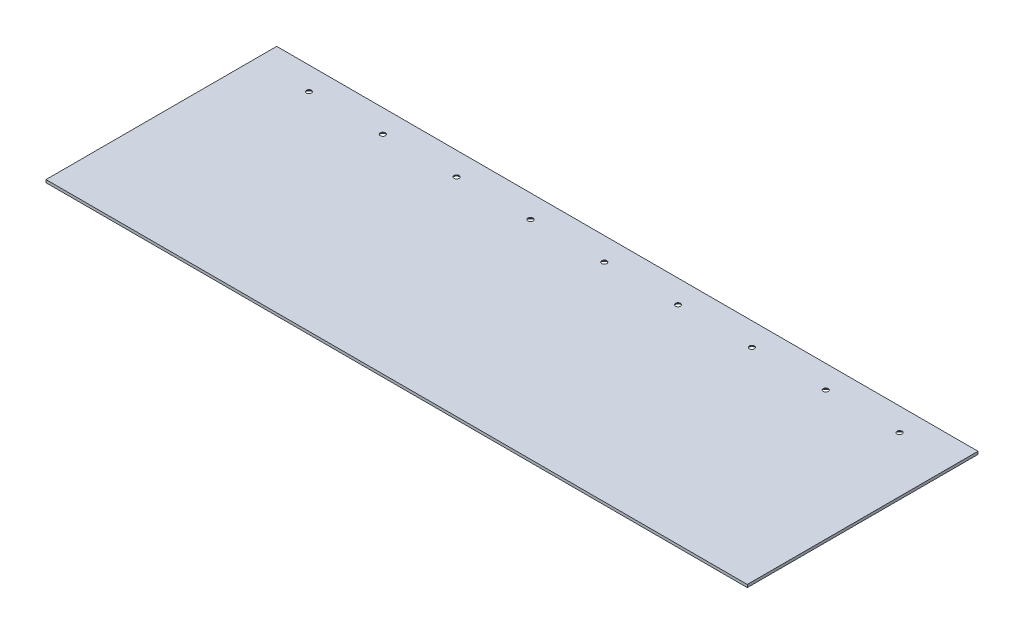
ISO-10303-21;
HEADER;
FILE_DESCRIPTION(('STEP AP214'),'2;1');
FILE_NAME('part.step','',(''),(''),'','','');
FILE_SCHEMA(('AUTOMOTIVE_DESIGN { 1 0 10303 214 1 1 1 1 }'));
ENDSEC;
DATA;
#1=APPLICATION_CONTEXT('core data for automotive mechanical design processes');
#2=APPLICATION_PROTOCOL_DEFINITION('international standard','automotive_design',2000,#1);
#3=PRODUCT_CONTEXT('',#1,'mechanical');
#4=PRODUCT('Part','Part','',(#3));
#5=PRODUCT_RELATED_PRODUCT_CATEGORY('part','',(#4));
#6=PRODUCT_DEFINITION_FORMATION('','',#4);
#7=PRODUCT_DEFINITION_CONTEXT('part definition',#1,'design');
#8=PRODUCT_DEFINITION('design','',#6,#7);
#9=PRODUCT_DEFINITION_SHAPE('','',#8);
#10=(LENGTH_UNIT() NAMED_UNIT(*) SI_UNIT(.MILLI.,.METRE.));
#11=(NAMED_UNIT(*) PLANE_ANGLE_UNIT() SI_UNIT($,.RADIAN.));
#12=(NAMED_UNIT(*) SI_UNIT($,.STERADIAN.) SOLID_ANGLE_UNIT());
#13=UNCERTAINTY_MEASURE_WITH_UNIT(LENGTH_MEASURE(1.E-05),#10,'distance_accuracy_value','');
#14=(GEOMETRIC_REPRESENTATION_CONTEXT(3) GLOBAL_UNCERTAINTY_ASSIGNED_CONTEXT((#13)) GLOBAL_UNIT_ASSIGNED_CONTEXT((#10,
#11,#12)) REPRESENTATION_CONTEXT('',''));
#15=CARTESIAN_POINT('',(0.,0.,0.));
#16=DIRECTION('',(0.,0.,1.));
#17=DIRECTION('',(1.,0.,0.));
#18=AXIS2_PLACEMENT_3D('',#15,#16,#17);
#19=CARTESIAN_POINT('',(380.,3.,-125.));
#20=DIRECTION('',(-1.,0.,0.));
#21=DIRECTION('',(0.,0.,1.));
#22=AXIS2_PLACEMENT_3D('',#19,#20,#21);
#23=PLANE('',#22);
#24=DIRECTION('',(0.,0.,-1.));
#25=VECTOR('',#24,1.);
#26=CARTESIAN_POINT('',(380.,0.,-125.));
#27=LINE('',#26,#25);
#28=CARTESIAN_POINT('',(380.,0.,125.));
#29=VERTEX_POINT('',#28);
#30=CARTESIAN_POINT('',(380.,0.,-125.));
#31=VERTEX_POINT('',#30);
#32=EDGE_CURVE('E106',#29,#31,#27,.T.);
#33=ORIENTED_EDGE('',*,*,#32,.T.);
#34=DIRECTION('',(0.,-1.,0.));
#35=VECTOR('',#34,1.);
#36=CARTESIAN_POINT('',(380.,3.,-125.));
#37=LINE('',#36,#35);
#38=CARTESIAN_POINT('',(380.,3.,-125.));
#39=VERTEX_POINT('',#38);
#40=EDGE_CURVE('E11',#39,#31,#37,.T.);
#41=ORIENTED_EDGE('',*,*,#40,.F.);
#42=DIRECTION('',(0.,0.,-1.));
#43=VECTOR('',#42,1.);
#44=CARTESIAN_POINT('',(380.,3.,-125.));
#45=LINE('',#44,#43);
#46=CARTESIAN_POINT('',(380.,3.,125.));
#47=VERTEX_POINT('',#46);
#48=EDGE_CURVE('E90',#47,#39,#45,.T.);
#49=ORIENTED_EDGE('',*,*,#48,.F.);
#50=DIRECTION('',(0.,-1.,0.));
#51=VECTOR('',#50,1.);
#52=CARTESIAN_POINT('',(380.,3.,125.));
#53=LINE('',#52,#51);
#54=EDGE_CURVE('E102',#47,#29,#53,.T.);
#55=ORIENTED_EDGE('',*,*,#54,.T.);
#56=EDGE_LOOP('',(#33,#41,#49,#55));
#57=FACE_BOUND('',#56,.T.);
#58=ADVANCED_FACE('F38',(#57),#23,.F.);
#59=CARTESIAN_POINT('',(-380.,3.,-125.));
#60=DIRECTION('',(0.,0.,1.));
#61=DIRECTION('',(1.,0.,0.));
#62=AXIS2_PLACEMENT_3D('',#59,#60,#61);
#63=PLANE('',#62);
#64=DIRECTION('',(-1.,0.,0.));
#65=VECTOR('',#64,1.);
#66=CARTESIAN_POINT('',(-380.,0.,-125.));
#67=LINE('',#66,#65);
#68=CARTESIAN_POINT('',(-380.,0.,-125.));
#69=VERTEX_POINT('',#68);
#70=EDGE_CURVE('E95',#31,#69,#67,.T.);
#71=ORIENTED_EDGE('',*,*,#70,.T.);
#72=DIRECTION('',(0.,-1.,0.));
#73=VECTOR('',#72,1.);
#74=CARTESIAN_POINT('',(-380.,3.,-125.));
#75=LINE('',#74,#73);
#76=CARTESIAN_POINT('',(-380.,3.,-125.));
#77=VERTEX_POINT('',#76);
#78=EDGE_CURVE('E47',#77,#69,#75,.T.);
#79=ORIENTED_EDGE('',*,*,#78,.F.);
#80=DIRECTION('',(-1.,0.,0.));
#81=VECTOR('',#80,1.);
#82=CARTESIAN_POINT('',(-380.,3.,-125.));
#83=LINE('',#82,#81);
#84=EDGE_CURVE('E85',#39,#77,#83,.T.);
#85=ORIENTED_EDGE('',*,*,#84,.F.);
#86=ORIENTED_EDGE('',*,*,#40,.T.);
#87=EDGE_LOOP('',(#71,#79,#85,#86));
#88=FACE_BOUND('',#87,.T.);
#89=ADVANCED_FACE('F94',(#88),#63,.F.);
#90=CARTESIAN_POINT('',(-380.,3.,-125.));
#91=DIRECTION('',(1.,0.,0.));
#92=DIRECTION('',(0.,0.,-1.));
#93=AXIS2_PLACEMENT_3D('',#90,#91,#92);
#94=PLANE('',#93);
#95=DIRECTION('',(0.,0.,1.));
#96=VECTOR('',#95,1.);
#97=CARTESIAN_POINT('',(-380.,0.,-125.));
#98=LINE('',#97,#96);
#99=CARTESIAN_POINT('',(-380.,0.,125.));
#100=VERTEX_POINT('',#99);
#101=EDGE_CURVE('E72',#69,#100,#98,.T.);
#102=ORIENTED_EDGE('',*,*,#101,.T.);
#103=DIRECTION('',(0.,-1.,0.));
#104=VECTOR('',#103,1.);
#105=CARTESIAN_POINT('',(-380.,3.,125.));
#106=LINE('',#105,#104);
#107=CARTESIAN_POINT('',(-380.,3.,125.));
#108=VERTEX_POINT('',#107);
#109=EDGE_CURVE('E97',#108,#100,#106,.T.);
#110=ORIENTED_EDGE('',*,*,#109,.F.);
#111=DIRECTION('',(0.,0.,1.));
#112=VECTOR('',#111,1.);
#113=CARTESIAN_POINT('',(-380.,3.,-125.));
#114=LINE('',#113,#112);
#115=EDGE_CURVE('E88',#77,#108,#114,.T.);
#116=ORIENTED_EDGE('',*,*,#115,.F.);
#117=ORIENTED_EDGE('',*,*,#78,.T.);
#118=EDGE_LOOP('',(#102,#110,#116,#117));
#119=FACE_BOUND('',#118,.T.);
#120=ADVANCED_FACE('F98',(#119),#94,.F.);
#121=CARTESIAN_POINT('',(-380.,3.,125.));
#122=DIRECTION('',(0.,0.,-1.));
#123=DIRECTION('',(-1.,0.,0.));
#124=AXIS2_PLACEMENT_3D('',#121,#122,#123);
#125=PLANE('',#124);
#126=DIRECTION('',(1.,0.,0.));
#127=VECTOR('',#126,1.);
#128=CARTESIAN_POINT('',(-380.,0.,125.));
#129=LINE('',#128,#127);
#130=EDGE_CURVE('E78',#100,#29,#129,.T.);
#131=ORIENTED_EDGE('',*,*,#130,.T.);
#132=ORIENTED_EDGE('',*,*,#54,.F.);
#133=DIRECTION('',(1.,0.,0.));
#134=VECTOR('',#133,1.);
#135=CARTESIAN_POINT('',(-380.,3.,125.));
#136=LINE('',#135,#134);
#137=EDGE_CURVE('E55',#108,#47,#136,.T.);
#138=ORIENTED_EDGE('',*,*,#137,.F.);
#139=ORIENTED_EDGE('',*,*,#109,.T.);
#140=EDGE_LOOP('',(#131,#132,#138,#139));
#141=FACE_BOUND('',#140,.T.);
#142=ADVANCED_FACE('F120',(#141),#125,.F.);
#143=CARTESIAN_POINT('',(0.,3.,0.));
#144=DIRECTION('',(0.,1.,0.));
#145=DIRECTION('',(0.,0.,1.));
#146=AXIS2_PLACEMENT_3D('',#143,#144,#145);
#147=PLANE('',#146);
#148=CARTESIAN_POINT('',(0.,3.,-100.));
#149=DIRECTION('',(0.,-1.,0.));
#150=DIRECTION('',(0.,0.,-1.));
#151=AXIS2_PLACEMENT_3D('',#148,#149,#150);
#152=CIRCLE('',#151,2.75);
#153=CARTESIAN_POINT('',(0.,3.,-102.75));
#154=VERTEX_POINT('',#153);
#155=EDGE_CURVE('E222',#154,#154,#152,.T.);
#156=ORIENTED_EDGE('',*,*,#155,.T.);
#157=EDGE_LOOP('',(#156));
#158=FACE_BOUND('',#157,.T.);
#159=CARTESIAN_POINT('',(-80.,3.,-100.));
#160=DIRECTION('',(0.,-1.,0.));
#161=DIRECTION('',(0.,0.,-1.));
#162=AXIS2_PLACEMENT_3D('',#159,#160,#161);
#163=CIRCLE('',#162,2.75);
#164=CARTESIAN_POINT('',(-80.,3.,-102.75));
#165=VERTEX_POINT('',#164);
#166=EDGE_CURVE('E210',#165,#165,#163,.T.);
#167=ORIENTED_EDGE('',*,*,#166,.T.);
#168=EDGE_LOOP('',(#167));
#169=FACE_BOUND('',#168,.T.);
#170=CARTESIAN_POINT('',(-160.,3.,-100.));
#171=DIRECTION('',(0.,-1.,0.));
#172=DIRECTION('',(0.,0.,-1.));
#173=AXIS2_PLACEMENT_3D('',#170,#171,#172);
#174=CIRCLE('',#173,2.75);
#175=CARTESIAN_POINT('',(-160.,3.,-102.75));
#176=VERTEX_POINT('',#175);
#177=EDGE_CURVE('E198',#176,#176,#174,.T.);
#178=ORIENTED_EDGE('',*,*,#177,.T.);
#179=EDGE_LOOP('',(#178));
#180=FACE_BOUND('',#179,.T.);
#181=CARTESIAN_POINT('',(-240.,3.,-100.));
#182=DIRECTION('',(0.,-1.,0.));
#183=DIRECTION('',(0.,0.,-1.));
#184=AXIS2_PLACEMENT_3D('',#181,#182,#183);
#185=CIRCLE('',#184,2.75);
#186=CARTESIAN_POINT('',(-240.,3.,-102.75));
#187=VERTEX_POINT('',#186);
#188=EDGE_CURVE('E186',#187,#187,#185,.T.);
#189=ORIENTED_EDGE('',*,*,#188,.T.);
#190=EDGE_LOOP('',(#189));
#191=FACE_BOUND('',#190,.T.);
#192=CARTESIAN_POINT('',(-320.,3.,-100.));
#193=DIRECTION('',(0.,-1.,0.));
#194=DIRECTION('',(0.,0.,-1.));
#195=AXIS2_PLACEMENT_3D('',#192,#193,#194);
#196=CIRCLE('',#195,2.74999999999997);
#197=CARTESIAN_POINT('',(-320.,3.,-102.75));
#198=VERTEX_POINT('',#197);
#199=EDGE_CURVE('E174',#198,#198,#196,.T.);
#200=ORIENTED_EDGE('',*,*,#199,.T.);
#201=EDGE_LOOP('',(#200));
#202=FACE_BOUND('',#201,.T.);
#203=CARTESIAN_POINT('',(80.,3.,-100.));
#204=DIRECTION('',(0.,-1.,0.));
#205=DIRECTION('',(0.,0.,-1.));
#206=AXIS2_PLACEMENT_3D('',#203,#204,#205);
#207=CIRCLE('',#206,2.75);
#208=CARTESIAN_POINT('',(80.,3.,-102.75));
#209=VERTEX_POINT('',#208);
#210=EDGE_CURVE('E162',#209,#209,#207,.T.);
#211=ORIENTED_EDGE('',*,*,#210,.T.);
#212=EDGE_LOOP('',(#211));
#213=FACE_BOUND('',#212,.T.);
#214=CARTESIAN_POINT('',(160.,3.,-100.));
#215=DIRECTION('',(0.,-1.,0.));
#216=DIRECTION('',(0.,0.,-1.));
#217=AXIS2_PLACEMENT_3D('',#214,#215,#216);
#218=CIRCLE('',#217,2.75);
#219=CARTESIAN_POINT('',(160.,3.,-102.75));
#220=VERTEX_POINT('',#219);
#221=EDGE_CURVE('E150',#220,#220,#218,.T.);
#222=ORIENTED_EDGE('',*,*,#221,.T.);
#223=EDGE_LOOP('',(#222));
#224=FACE_BOUND('',#223,.T.);
#225=CARTESIAN_POINT('',(240.,3.,-100.));
#226=DIRECTION('',(0.,-1.,0.));
#227=DIRECTION('',(0.,0.,-1.));
#228=AXIS2_PLACEMENT_3D('',#225,#226,#227);
#229=CIRCLE('',#228,2.75);
#230=CARTESIAN_POINT('',(240.,3.,-102.75));
#231=VERTEX_POINT('',#230);
#232=EDGE_CURVE('E138',#231,#231,#229,.T.);
#233=ORIENTED_EDGE('',*,*,#232,.T.);
#234=EDGE_LOOP('',(#233));
#235=FACE_BOUND('',#234,.T.);
#236=CARTESIAN_POINT('',(320.,3.,-100.));
#237=DIRECTION('',(0.,-1.,0.));
#238=DIRECTION('',(0.,0.,-1.));
#239=AXIS2_PLACEMENT_3D('',#236,#237,#238);
#240=CIRCLE('',#239,2.74999999999997);
#241=CARTESIAN_POINT('',(320.,3.,-102.75));
#242=VERTEX_POINT('',#241);
#243=EDGE_CURVE('E110',#242,#242,#240,.T.);
#244=ORIENTED_EDGE('',*,*,#243,.T.);
#245=EDGE_LOOP('',(#244));
#246=FACE_BOUND('',#245,.T.);
#247=ORIENTED_EDGE('',*,*,#48,.T.);
#248=ORIENTED_EDGE('',*,*,#84,.T.);
#249=ORIENTED_EDGE('',*,*,#115,.T.);
#250=ORIENTED_EDGE('',*,*,#137,.T.);
#251=EDGE_LOOP('',(#247,#248,#249,#250));
#252=FACE_BOUND('',#251,.T.);
#253=ADVANCED_FACE('F86',(#158,#169,#180,#191,#202,#213,#224,#235,#246,#252),#147,.T.);
#254=CARTESIAN_POINT('',(0.,0.,0.));
#255=DIRECTION('',(0.,1.,0.));
#256=DIRECTION('',(0.,0.,1.));
#257=AXIS2_PLACEMENT_3D('',#254,#255,#256);
#258=PLANE('',#257);
#259=CARTESIAN_POINT('',(0.,0.,-100.));
#260=DIRECTION('',(0.,-1.,0.));
#261=DIRECTION('',(0.,0.,-1.));
#262=AXIS2_PLACEMENT_3D('',#259,#260,#261);
#263=CIRCLE('',#262,5.2);
#264=CARTESIAN_POINT('',(0.,0.,-105.2));
#265=VERTEX_POINT('',#264);
#266=EDGE_CURVE('E230',#265,#265,#263,.T.);
#267=ORIENTED_EDGE('',*,*,#266,.F.);
#268=EDGE_LOOP('',(#267));
#269=FACE_BOUND('',#268,.T.);
#270=CARTESIAN_POINT('',(-80.,0.,-100.));
#271=DIRECTION('',(0.,-1.,0.));
#272=DIRECTION('',(0.,0.,-1.));
#273=AXIS2_PLACEMENT_3D('',#270,#271,#272);
#274=CIRCLE('',#273,5.2);
#275=CARTESIAN_POINT('',(-80.,0.,-105.2));
#276=VERTEX_POINT('',#275);
#277=EDGE_CURVE('E218',#276,#276,#274,.T.);
#278=ORIENTED_EDGE('',*,*,#277,.F.);
#279=EDGE_LOOP('',(#278));
#280=FACE_BOUND('',#279,.T.);
#281=CARTESIAN_POINT('',(-160.,0.,-100.));
#282=DIRECTION('',(0.,-1.,0.));
#283=DIRECTION('',(0.,0.,-1.));
#284=AXIS2_PLACEMENT_3D('',#281,#282,#283);
#285=CIRCLE('',#284,5.20000000000001);
#286=CARTESIAN_POINT('',(-160.,0.,-105.2));
#287=VERTEX_POINT('',#286);
#288=EDGE_CURVE('E206',#287,#287,#285,.T.);
#289=ORIENTED_EDGE('',*,*,#288,.F.);
#290=EDGE_LOOP('',(#289));
#291=FACE_BOUND('',#290,.T.);
#292=CARTESIAN_POINT('',(-240.,0.,-100.));
#293=DIRECTION('',(0.,-1.,0.));
#294=DIRECTION('',(0.,0.,-1.));
#295=AXIS2_PLACEMENT_3D('',#292,#293,#294);
#296=CIRCLE('',#295,5.20000000000001);
#297=CARTESIAN_POINT('',(-240.,0.,-105.2));
#298=VERTEX_POINT('',#297);
#299=EDGE_CURVE('E194',#298,#298,#296,.T.);
#300=ORIENTED_EDGE('',*,*,#299,.F.);
#301=EDGE_LOOP('',(#300));
#302=FACE_BOUND('',#301,.T.);
#303=CARTESIAN_POINT('',(-320.,0.,-100.));
#304=DIRECTION('',(0.,-1.,0.));
#305=DIRECTION('',(0.,0.,-1.));
#306=AXIS2_PLACEMENT_3D('',#303,#304,#305);
#307=CIRCLE('',#306,5.19999999999998);
#308=CARTESIAN_POINT('',(-320.,0.,-105.2));
#309=VERTEX_POINT('',#308);
#310=EDGE_CURVE('E182',#309,#309,#307,.T.);
#311=ORIENTED_EDGE('',*,*,#310,.F.);
#312=EDGE_LOOP('',(#311));
#313=FACE_BOUND('',#312,.T.);
#314=CARTESIAN_POINT('',(80.,0.,-100.));
#315=DIRECTION('',(0.,-1.,0.));
#316=DIRECTION('',(0.,0.,-1.));
#317=AXIS2_PLACEMENT_3D('',#314,#315,#316);
#318=CIRCLE('',#317,5.2);
#319=CARTESIAN_POINT('',(80.,0.,-105.2));
#320=VERTEX_POINT('',#319);
#321=EDGE_CURVE('E170',#320,#320,#318,.T.);
#322=ORIENTED_EDGE('',*,*,#321,.F.);
#323=EDGE_LOOP('',(#322));
#324=FACE_BOUND('',#323,.T.);
#325=CARTESIAN_POINT('',(160.,0.,-100.));
#326=DIRECTION('',(0.,-1.,0.));
#327=DIRECTION('',(0.,0.,-1.));
#328=AXIS2_PLACEMENT_3D('',#325,#326,#327);
#329=CIRCLE('',#328,5.20000000000001);
#330=CARTESIAN_POINT('',(160.,0.,-105.2));
#331=VERTEX_POINT('',#330);
#332=EDGE_CURVE('E158',#331,#331,#329,.T.);
#333=ORIENTED_EDGE('',*,*,#332,.F.);
#334=EDGE_LOOP('',(#333));
#335=FACE_BOUND('',#334,.T.);
#336=CARTESIAN_POINT('',(240.,0.,-100.));
#337=DIRECTION('',(0.,-1.,0.));
#338=DIRECTION('',(0.,0.,-1.));
#339=AXIS2_PLACEMENT_3D('',#336,#337,#338);
#340=CIRCLE('',#339,5.20000000000001);
#341=CARTESIAN_POINT('',(240.,0.,-105.2));
#342=VERTEX_POINT('',#341);
#343=EDGE_CURVE('E146',#342,#342,#340,.T.);
#344=ORIENTED_EDGE('',*,*,#343,.F.);
#345=EDGE_LOOP('',(#344));
#346=FACE_BOUND('',#345,.T.);
#347=CARTESIAN_POINT('',(320.,0.,-100.));
#348=DIRECTION('',(0.,-1.,0.));
#349=DIRECTION('',(0.,0.,-1.));
#350=AXIS2_PLACEMENT_3D('',#347,#348,#349);
#351=CIRCLE('',#350,5.19999999999998);
#352=CARTESIAN_POINT('',(320.,0.,-105.2));
#353=VERTEX_POINT('',#352);
#354=EDGE_CURVE('E134',#353,#353,#351,.T.);
#355=ORIENTED_EDGE('',*,*,#354,.F.);
#356=EDGE_LOOP('',(#355));
#357=FACE_BOUND('',#356,.T.);
#358=ORIENTED_EDGE('',*,*,#32,.F.);
#359=ORIENTED_EDGE('',*,*,#130,.F.);
#360=ORIENTED_EDGE('',*,*,#101,.F.);
#361=ORIENTED_EDGE('',*,*,#70,.F.);
#362=EDGE_LOOP('',(#358,#359,#360,#361));
#363=FACE_BOUND('',#362,.T.);
#364=ADVANCED_FACE('F123',(#269,#280,#291,#302,#313,#324,#335,#346,#357,#363),#258,.F.);
#365=CARTESIAN_POINT('',(320.,0.,-100.));
#366=DIRECTION('',(0.,-1.,0.));
#367=DIRECTION('',(0.,0.,-1.));
#368=AXIS2_PLACEMENT_3D('',#365,#366,#367);
#369=CYLINDRICAL_SURFACE('',#368,2.74999999999997);
#370=ORIENTED_EDGE('',*,*,#243,.F.);
#371=EDGE_LOOP('',(#370));
#372=FACE_BOUND('',#371,.T.);
#373=CARTESIAN_POINT('',(320.,2.45,-100.));
#374=DIRECTION('',(0.,-1.,0.));
#375=DIRECTION('',(0.,0.,-1.));
#376=AXIS2_PLACEMENT_3D('',#373,#374,#375);
#377=CIRCLE('',#376,2.74999999999997);
#378=CARTESIAN_POINT('',(320.,2.45,-102.75));
#379=VERTEX_POINT('',#378);
#380=EDGE_CURVE('E130',#379,#379,#377,.T.);
#381=ORIENTED_EDGE('',*,*,#380,.T.);
#382=EDGE_LOOP('',(#381));
#383=FACE_BOUND('',#382,.T.);
#384=ADVANCED_FACE('F239',(#372,#383),#369,.F.);
#385=CARTESIAN_POINT('',(320.,0.,-100.));
#386=DIRECTION('',(0.,-1.,0.));
#387=DIRECTION('',(0.,0.,-1.));
#388=AXIS2_PLACEMENT_3D('',#385,#386,#387);
#389=CONICAL_SURFACE('',#388,5.19999999999998,0.78539816339745);
#390=ORIENTED_EDGE('',*,*,#380,.F.);
#391=EDGE_LOOP('',(#390));
#392=FACE_BOUND('',#391,.T.);
#393=ORIENTED_EDGE('',*,*,#354,.T.);
#394=EDGE_LOOP('',(#393));
#395=FACE_BOUND('',#394,.T.);
#396=ADVANCED_FACE('F257',(#392,#395),#389,.F.);
#397=CARTESIAN_POINT('',(240.,0.,-100.));
#398=DIRECTION('',(0.,-1.,0.));
#399=DIRECTION('',(0.,0.,-1.));
#400=AXIS2_PLACEMENT_3D('',#397,#398,#399);
#401=CYLINDRICAL_SURFACE('',#400,2.75);
#402=ORIENTED_EDGE('',*,*,#232,.F.);
#403=EDGE_LOOP('',(#402));
#404=FACE_BOUND('',#403,.T.);
#405=CARTESIAN_POINT('',(240.,2.45,-100.));
#406=DIRECTION('',(0.,-1.,0.));
#407=DIRECTION('',(0.,0.,-1.));
#408=AXIS2_PLACEMENT_3D('',#405,#406,#407);
#409=CIRCLE('',#408,2.75);
#410=CARTESIAN_POINT('',(240.,2.45,-102.75));
#411=VERTEX_POINT('',#410);
#412=EDGE_CURVE('E142',#411,#411,#409,.T.);
#413=ORIENTED_EDGE('',*,*,#412,.T.);
#414=EDGE_LOOP('',(#413));
#415=FACE_BOUND('',#414,.T.);
#416=ADVANCED_FACE('F259',(#404,#415),#401,.F.);
#417=CARTESIAN_POINT('',(240.,0.,-100.));
#418=DIRECTION('',(0.,-1.,0.));
#419=DIRECTION('',(0.,0.,-1.));
#420=AXIS2_PLACEMENT_3D('',#417,#418,#419);
#421=CONICAL_SURFACE('',#420,5.20000000000001,0.78539816339745);
#422=ORIENTED_EDGE('',*,*,#412,.F.);
#423=EDGE_LOOP('',(#422));
#424=FACE_BOUND('',#423,.T.);
#425=ORIENTED_EDGE('',*,*,#343,.T.);
#426=EDGE_LOOP('',(#425));
#427=FACE_BOUND('',#426,.T.);
#428=ADVANCED_FACE('F266',(#424,#427),#421,.F.);
#429=CARTESIAN_POINT('',(160.,0.,-100.));
#430=DIRECTION('',(0.,-1.,0.));
#431=DIRECTION('',(0.,0.,-1.));
#432=AXIS2_PLACEMENT_3D('',#429,#430,#431);
#433=CYLINDRICAL_SURFACE('',#432,2.75);
#434=ORIENTED_EDGE('',*,*,#221,.F.);
#435=EDGE_LOOP('',(#434));
#436=FACE_BOUND('',#435,.T.);
#437=CARTESIAN_POINT('',(160.,2.45,-100.));
#438=DIRECTION('',(0.,-1.,0.));
#439=DIRECTION('',(0.,0.,-1.));
#440=AXIS2_PLACEMENT_3D('',#437,#438,#439);
#441=CIRCLE('',#440,2.75);
#442=CARTESIAN_POINT('',(160.,2.45,-102.75));
#443=VERTEX_POINT('',#442);
#444=EDGE_CURVE('E154',#443,#443,#441,.T.);
#445=ORIENTED_EDGE('',*,*,#444,.T.);
#446=EDGE_LOOP('',(#445));
#447=FACE_BOUND('',#446,.T.);
#448=ADVANCED_FACE('F311',(#436,#447),#433,.F.);
#449=CARTESIAN_POINT('',(160.,0.,-100.));
#450=DIRECTION('',(0.,-1.,0.));
#451=DIRECTION('',(0.,0.,-1.));
#452=AXIS2_PLACEMENT_3D('',#449,#450,#451);
#453=CONICAL_SURFACE('',#452,5.20000000000001,0.78539816339745);
#454=ORIENTED_EDGE('',*,*,#444,.F.);
#455=EDGE_LOOP('',(#454));
#456=FACE_BOUND('',#455,.T.);
#457=ORIENTED_EDGE('',*,*,#332,.T.);
#458=EDGE_LOOP('',(#457));
#459=FACE_BOUND('',#458,.T.);
#460=ADVANCED_FACE('F316',(#456,#459),#453,.F.);
#461=CARTESIAN_POINT('',(80.,0.,-100.));
#462=DIRECTION('',(0.,-1.,0.));
#463=DIRECTION('',(0.,0.,-1.));
#464=AXIS2_PLACEMENT_3D('',#461,#462,#463);
#465=CYLINDRICAL_SURFACE('',#464,2.75);
#466=ORIENTED_EDGE('',*,*,#210,.F.);
#467=EDGE_LOOP('',(#466));
#468=FACE_BOUND('',#467,.T.);
#469=CARTESIAN_POINT('',(80.,2.45,-100.));
#470=DIRECTION('',(0.,-1.,0.));
#471=DIRECTION('',(0.,0.,-1.));
#472=AXIS2_PLACEMENT_3D('',#469,#470,#471);
#473=CIRCLE('',#472,2.75);
#474=CARTESIAN_POINT('',(80.,2.45,-102.75));
#475=VERTEX_POINT('',#474);
#476=EDGE_CURVE('E166',#475,#475,#473,.T.);
#477=ORIENTED_EDGE('',*,*,#476,.T.);
#478=EDGE_LOOP('',(#477));
#479=FACE_BOUND('',#478,.T.);
#480=ADVANCED_FACE('F322',(#468,#479),#465,.F.);
#481=CARTESIAN_POINT('',(80.,0.,-100.));
#482=DIRECTION('',(0.,-1.,0.));
#483=DIRECTION('',(0.,0.,-1.));
#484=AXIS2_PLACEMENT_3D('',#481,#482,#483);
#485=CONICAL_SURFACE('',#484,5.2,0.785398163397447);
#486=ORIENTED_EDGE('',*,*,#476,.F.);
#487=EDGE_LOOP('',(#486));
#488=FACE_BOUND('',#487,.T.);
#489=ORIENTED_EDGE('',*,*,#321,.T.);
#490=EDGE_LOOP('',(#489));
#491=FACE_BOUND('',#490,.T.);
#492=ADVANCED_FACE('F326',(#488,#491),#485,.F.);
#493=CARTESIAN_POINT('',(-320.,0.,-100.));
#494=DIRECTION('',(0.,-1.,0.));
#495=DIRECTION('',(0.,0.,-1.));
#496=AXIS2_PLACEMENT_3D('',#493,#494,#495);
#497=CYLINDRICAL_SURFACE('',#496,2.74999999999997);
#498=ORIENTED_EDGE('',*,*,#199,.F.);
#499=EDGE_LOOP('',(#498));
#500=FACE_BOUND('',#499,.T.);
#501=CARTESIAN_POINT('',(-320.,2.45,-100.));
#502=DIRECTION('',(0.,-1.,0.));
#503=DIRECTION('',(0.,0.,-1.));
#504=AXIS2_PLACEMENT_3D('',#501,#502,#503);
#505=CIRCLE('',#504,2.74999999999997);
#506=CARTESIAN_POINT('',(-320.,2.45,-102.75));
#507=VERTEX_POINT('',#506);
#508=EDGE_CURVE('E178',#507,#507,#505,.T.);
#509=ORIENTED_EDGE('',*,*,#508,.T.);
#510=EDGE_LOOP('',(#509));
#511=FACE_BOUND('',#510,.T.);
#512=ADVANCED_FACE('F330',(#500,#511),#497,.F.);
#513=CARTESIAN_POINT('',(-320.,0.,-100.));
#514=DIRECTION('',(0.,-1.,0.));
#515=DIRECTION('',(0.,0.,-1.));
#516=AXIS2_PLACEMENT_3D('',#513,#514,#515);
#517=CONICAL_SURFACE('',#516,5.19999999999998,0.78539816339745);
#518=ORIENTED_EDGE('',*,*,#508,.F.);
#519=EDGE_LOOP('',(#518));
#520=FACE_BOUND('',#519,.T.);
#521=ORIENTED_EDGE('',*,*,#310,.T.);
#522=EDGE_LOOP('',(#521));
#523=FACE_BOUND('',#522,.T.);
#524=ADVANCED_FACE('F334',(#520,#523),#517,.F.);
#525=CARTESIAN_POINT('',(-240.,0.,-100.));
#526=DIRECTION('',(0.,-1.,0.));
#527=DIRECTION('',(0.,0.,-1.));
#528=AXIS2_PLACEMENT_3D('',#525,#526,#527);
#529=CYLINDRICAL_SURFACE('',#528,2.75);
#530=ORIENTED_EDGE('',*,*,#188,.F.);
#531=EDGE_LOOP('',(#530));
#532=FACE_BOUND('',#531,.T.);
#533=CARTESIAN_POINT('',(-240.,2.45,-100.));
#534=DIRECTION('',(0.,-1.,0.));
#535=DIRECTION('',(0.,0.,-1.));
#536=AXIS2_PLACEMENT_3D('',#533,#534,#535);
#537=CIRCLE('',#536,2.75);
#538=CARTESIAN_POINT('',(-240.,2.45,-102.75));
#539=VERTEX_POINT('',#538);
#540=EDGE_CURVE('E190',#539,#539,#537,.T.);
#541=ORIENTED_EDGE('',*,*,#540,.T.);
#542=EDGE_LOOP('',(#541));
#543=FACE_BOUND('',#542,.T.);
#544=ADVANCED_FACE('F338',(#532,#543),#529,.F.);
#545=CARTESIAN_POINT('',(-240.,0.,-100.));
#546=DIRECTION('',(0.,-1.,0.));
#547=DIRECTION('',(0.,0.,-1.));
#548=AXIS2_PLACEMENT_3D('',#545,#546,#547);
#549=CONICAL_SURFACE('',#548,5.20000000000001,0.78539816339745);
#550=ORIENTED_EDGE('',*,*,#540,.F.);
#551=EDGE_LOOP('',(#550));
#552=FACE_BOUND('',#551,.T.);
#553=ORIENTED_EDGE('',*,*,#299,.T.);
#554=EDGE_LOOP('',(#553));
#555=FACE_BOUND('',#554,.T.);
#556=ADVANCED_FACE('F342',(#552,#555),#549,.F.);
#557=CARTESIAN_POINT('',(-160.,0.,-100.));
#558=DIRECTION('',(0.,-1.,0.));
#559=DIRECTION('',(0.,0.,-1.));
#560=AXIS2_PLACEMENT_3D('',#557,#558,#559);
#561=CYLINDRICAL_SURFACE('',#560,2.75);
#562=ORIENTED_EDGE('',*,*,#177,.F.);
#563=EDGE_LOOP('',(#562));
#564=FACE_BOUND('',#563,.T.);
#565=CARTESIAN_POINT('',(-160.,2.45,-100.));
#566=DIRECTION('',(0.,-1.,0.));
#567=DIRECTION('',(0.,0.,-1.));
#568=AXIS2_PLACEMENT_3D('',#565,#566,#567);
#569=CIRCLE('',#568,2.75);
#570=CARTESIAN_POINT('',(-160.,2.45,-102.75));
#571=VERTEX_POINT('',#570);
#572=EDGE_CURVE('E202',#571,#571,#569,.T.);
#573=ORIENTED_EDGE('',*,*,#572,.T.);
#574=EDGE_LOOP('',(#573));
#575=FACE_BOUND('',#574,.T.);
#576=ADVANCED_FACE('F346',(#564,#575),#561,.F.);
#577=CARTESIAN_POINT('',(-160.,0.,-100.));
#578=DIRECTION('',(0.,-1.,0.));
#579=DIRECTION('',(0.,0.,-1.));
#580=AXIS2_PLACEMENT_3D('',#577,#578,#579);
#581=CONICAL_SURFACE('',#580,5.20000000000001,0.78539816339745);
#582=ORIENTED_EDGE('',*,*,#572,.F.);
#583=EDGE_LOOP('',(#582));
#584=FACE_BOUND('',#583,.T.);
#585=ORIENTED_EDGE('',*,*,#288,.T.);
#586=EDGE_LOOP('',(#585));
#587=FACE_BOUND('',#586,.T.);
#588=ADVANCED_FACE('F350',(#584,#587),#581,.F.);
#589=CARTESIAN_POINT('',(-80.,0.,-100.));
#590=DIRECTION('',(0.,-1.,0.));
#591=DIRECTION('',(0.,0.,-1.));
#592=AXIS2_PLACEMENT_3D('',#589,#590,#591);
#593=CYLINDRICAL_SURFACE('',#592,2.75);
#594=ORIENTED_EDGE('',*,*,#166,.F.);
#595=EDGE_LOOP('',(#594));
#596=FACE_BOUND('',#595,.T.);
#597=CARTESIAN_POINT('',(-80.,2.45,-100.));
#598=DIRECTION('',(0.,-1.,0.));
#599=DIRECTION('',(0.,0.,-1.));
#600=AXIS2_PLACEMENT_3D('',#597,#598,#599);
#601=CIRCLE('',#600,2.75);
#602=CARTESIAN_POINT('',(-80.,2.45,-102.75));
#603=VERTEX_POINT('',#602);
#604=EDGE_CURVE('E214',#603,#603,#601,.T.);
#605=ORIENTED_EDGE('',*,*,#604,.T.);
#606=EDGE_LOOP('',(#605));
#607=FACE_BOUND('',#606,.T.);
#608=ADVANCED_FACE('F354',(#596,#607),#593,.F.);
#609=CARTESIAN_POINT('',(-80.,0.,-100.));
#610=DIRECTION('',(0.,-1.,0.));
#611=DIRECTION('',(0.,0.,-1.));
#612=AXIS2_PLACEMENT_3D('',#609,#610,#611);
#613=CONICAL_SURFACE('',#612,5.2,0.785398163397447);
#614=ORIENTED_EDGE('',*,*,#604,.F.);
#615=EDGE_LOOP('',(#614));
#616=FACE_BOUND('',#615,.T.);
#617=ORIENTED_EDGE('',*,*,#277,.T.);
#618=EDGE_LOOP('',(#617));
#619=FACE_BOUND('',#618,.T.);
#620=ADVANCED_FACE('F358',(#616,#619),#613,.F.);
#621=CARTESIAN_POINT('',(0.,0.,-100.));
#622=DIRECTION('',(0.,-1.,0.));
#623=DIRECTION('',(0.,0.,-1.));
#624=AXIS2_PLACEMENT_3D('',#621,#622,#623);
#625=CYLINDRICAL_SURFACE('',#624,2.75);
#626=ORIENTED_EDGE('',*,*,#155,.F.);
#627=EDGE_LOOP('',(#626));
#628=FACE_BOUND('',#627,.T.);
#629=CARTESIAN_POINT('',(0.,2.45,-100.));
#630=DIRECTION('',(0.,-1.,0.));
#631=DIRECTION('',(0.,0.,-1.));
#632=AXIS2_PLACEMENT_3D('',#629,#630,#631);
#633=CIRCLE('',#632,2.75);
#634=CARTESIAN_POINT('',(0.,2.45,-102.75));
#635=VERTEX_POINT('',#634);
#636=EDGE_CURVE('E226',#635,#635,#633,.T.);
#637=ORIENTED_EDGE('',*,*,#636,.T.);
#638=EDGE_LOOP('',(#637));
#639=FACE_BOUND('',#638,.T.);
#640=ADVANCED_FACE('F362',(#628,#639),#625,.F.);
#641=CARTESIAN_POINT('',(0.,0.,-100.));
#642=DIRECTION('',(0.,-1.,0.));
#643=DIRECTION('',(0.,0.,-1.));
#644=AXIS2_PLACEMENT_3D('',#641,#642,#643);
#645=CONICAL_SURFACE('',#644,5.2,0.785398163397449);
#646=ORIENTED_EDGE('',*,*,#636,.F.);
#647=EDGE_LOOP('',(#646));
#648=FACE_BOUND('',#647,.T.);
#649=ORIENTED_EDGE('',*,*,#266,.T.);
#650=EDGE_LOOP('',(#649));
#651=FACE_BOUND('',#650,.T.);
#652=ADVANCED_FACE('F235',(#648,#651),#645,.F.);
#653=CLOSED_SHELL('',(#58,#89,#120,#142,#253,#364,#384,#396,#416,#428,#448,#460,#480,#492,#512,
#524,#544,#556,#576,#588,#608,#620,#640,#652));
#654=MANIFOLD_SOLID_BREP('B2',#653);
#655=ADVANCED_BREP_SHAPE_REPRESENTATION('',(#18,#654),#14);
#656=SHAPE_DEFINITION_REPRESENTATION(#9,#655);
ENDSEC;
END-ISO-10303-21;
